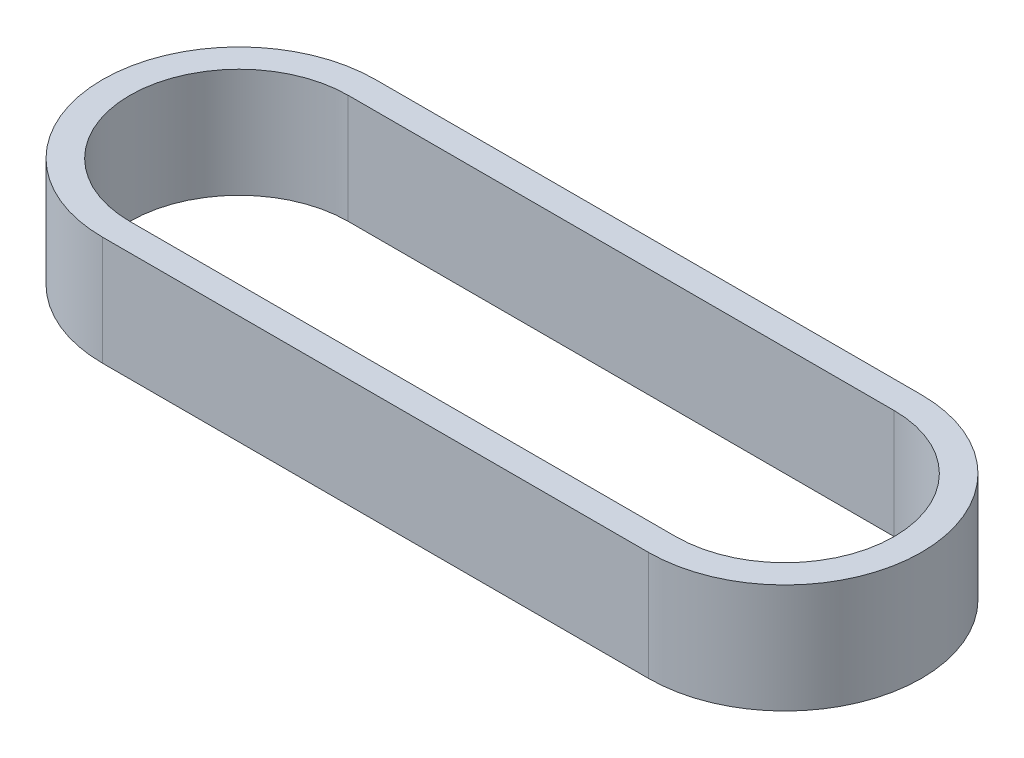
ISO-10303-21;
HEADER;
FILE_DESCRIPTION(('STEP AP214'),'2;1');
FILE_NAME('part.step','',(''),(''),'','','');
FILE_SCHEMA(('AUTOMOTIVE_DESIGN { 1 0 10303 214 1 1 1 1 }'));
ENDSEC;
DATA;
#1=APPLICATION_CONTEXT('core data for automotive mechanical design processes');
#2=APPLICATION_PROTOCOL_DEFINITION('international standard','automotive_design',2000,#1);
#3=PRODUCT_CONTEXT('',#1,'mechanical');
#4=PRODUCT('Part','Part','',(#3));
#5=PRODUCT_RELATED_PRODUCT_CATEGORY('part','',(#4));
#6=PRODUCT_DEFINITION_FORMATION('','',#4);
#7=PRODUCT_DEFINITION_CONTEXT('part definition',#1,'design');
#8=PRODUCT_DEFINITION('design','',#6,#7);
#9=PRODUCT_DEFINITION_SHAPE('','',#8);
#10=(LENGTH_UNIT() NAMED_UNIT(*) SI_UNIT(.MILLI.,.METRE.));
#11=(NAMED_UNIT(*) PLANE_ANGLE_UNIT() SI_UNIT($,.RADIAN.));
#12=(NAMED_UNIT(*) SI_UNIT($,.STERADIAN.) SOLID_ANGLE_UNIT());
#13=UNCERTAINTY_MEASURE_WITH_UNIT(LENGTH_MEASURE(1.E-05),#10,'distance_accuracy_value','');
#14=(GEOMETRIC_REPRESENTATION_CONTEXT(3) GLOBAL_UNCERTAINTY_ASSIGNED_CONTEXT((#13)) GLOBAL_UNIT_ASSIGNED_CONTEXT((#10,
#11,#12)) REPRESENTATION_CONTEXT('',''));
#15=CARTESIAN_POINT('',(0.,0.,0.));
#16=DIRECTION('',(0.,0.,1.));
#17=DIRECTION('',(1.,0.,0.));
#18=AXIS2_PLACEMENT_3D('',#15,#16,#17);
#19=CARTESIAN_POINT('',(-50.,20.,0.));
#20=DIRECTION('',(0.,-1.,0.));
#21=DIRECTION('',(0.,0.,-1.));
#22=AXIS2_PLACEMENT_3D('',#19,#20,#21);
#23=CYLINDRICAL_SURFACE('',#22,20.0000000000017);
#24=CARTESIAN_POINT('',(-50.,0.,0.));
#25=DIRECTION('',(0.,1.,0.));
#26=DIRECTION('',(0.,0.,1.));
#27=AXIS2_PLACEMENT_3D('',#24,#25,#26);
#28=CIRCLE('',#27,20.0000000000017);
#29=CARTESIAN_POINT('',(-50.,0.,-20.));
#30=VERTEX_POINT('',#29);
#31=CARTESIAN_POINT('',(-50.,0.,20.));
#32=VERTEX_POINT('',#31);
#33=EDGE_CURVE('E161',#30,#32,#28,.T.);
#34=ORIENTED_EDGE('',*,*,#33,.F.);
#35=DIRECTION('',(0.,-1.,0.));
#36=VECTOR('',#35,1.);
#37=CARTESIAN_POINT('',(-50.,20.,-20.));
#38=LINE('',#37,#36);
#39=CARTESIAN_POINT('',(-50.,20.,-20.));
#40=VERTEX_POINT('',#39);
#41=EDGE_CURVE('E11',#40,#30,#38,.T.);
#42=ORIENTED_EDGE('',*,*,#41,.F.);
#43=CARTESIAN_POINT('',(-50.,20.,0.));
#44=DIRECTION('',(0.,1.,0.));
#45=DIRECTION('',(0.,0.,1.));
#46=AXIS2_PLACEMENT_3D('',#43,#44,#45);
#47=CIRCLE('',#46,20.0000000000017);
#48=CARTESIAN_POINT('',(-50.,20.,20.));
#49=VERTEX_POINT('',#48);
#50=EDGE_CURVE('E126',#40,#49,#47,.T.);
#51=ORIENTED_EDGE('',*,*,#50,.T.);
#52=DIRECTION('',(0.,-1.,0.));
#53=VECTOR('',#52,1.);
#54=CARTESIAN_POINT('',(-50.,20.,20.));
#55=LINE('',#54,#53);
#56=EDGE_CURVE('E65',#49,#32,#55,.T.);
#57=ORIENTED_EDGE('',*,*,#56,.T.);
#58=EDGE_LOOP('',(#34,#42,#51,#57));
#59=FACE_BOUND('',#58,.T.);
#60=ADVANCED_FACE('F45',(#59),#23,.F.);
#61=CARTESIAN_POINT('',(0.,20.,-20.));
#62=DIRECTION('',(0.,0.,-1.));
#63=DIRECTION('',(-1.,0.,0.));
#64=AXIS2_PLACEMENT_3D('',#61,#62,#63);
#65=PLANE('',#64);
#66=DIRECTION('',(1.,0.,0.));
#67=VECTOR('',#66,1.);
#68=CARTESIAN_POINT('',(0.,0.,-20.));
#69=LINE('',#68,#67);
#70=CARTESIAN_POINT('',(50.,0.,-20.));
#71=VERTEX_POINT('',#70);
#72=EDGE_CURVE('E133',#30,#71,#69,.T.);
#73=ORIENTED_EDGE('',*,*,#72,.T.);
#74=DIRECTION('',(0.,-1.,0.));
#75=VECTOR('',#74,1.);
#76=CARTESIAN_POINT('',(50.,20.,-20.));
#77=LINE('',#76,#75);
#78=CARTESIAN_POINT('',(50.,20.,-20.));
#79=VERTEX_POINT('',#78);
#80=EDGE_CURVE('E56',#79,#71,#77,.T.);
#81=ORIENTED_EDGE('',*,*,#80,.F.);
#82=DIRECTION('',(1.,0.,0.));
#83=VECTOR('',#82,1.);
#84=CARTESIAN_POINT('',(0.,20.,-20.));
#85=LINE('',#84,#83);
#86=EDGE_CURVE('E120',#40,#79,#85,.T.);
#87=ORIENTED_EDGE('',*,*,#86,.F.);
#88=ORIENTED_EDGE('',*,*,#41,.T.);
#89=EDGE_LOOP('',(#73,#81,#87,#88));
#90=FACE_BOUND('',#89,.T.);
#91=ADVANCED_FACE('F131',(#90),#65,.F.);
#92=CARTESIAN_POINT('',(50.,20.,0.));
#93=DIRECTION('',(0.,-1.,0.));
#94=DIRECTION('',(0.,0.,-1.));
#95=AXIS2_PLACEMENT_3D('',#92,#93,#94);
#96=CYLINDRICAL_SURFACE('',#95,19.9999999999996);
#97=CARTESIAN_POINT('',(50.,0.,0.));
#98=DIRECTION('',(0.,1.,0.));
#99=DIRECTION('',(0.,0.,1.));
#100=AXIS2_PLACEMENT_3D('',#97,#98,#99);
#101=CIRCLE('',#100,19.9999999999996);
#102=CARTESIAN_POINT('',(50.,0.,20.));
#103=VERTEX_POINT('',#102);
#104=EDGE_CURVE('E166',#103,#71,#101,.T.);
#105=ORIENTED_EDGE('',*,*,#104,.F.);
#106=DIRECTION('',(0.,-1.,0.));
#107=VECTOR('',#106,1.);
#108=CARTESIAN_POINT('',(50.,20.,20.));
#109=LINE('',#108,#107);
#110=CARTESIAN_POINT('',(50.,20.,20.));
#111=VERTEX_POINT('',#110);
#112=EDGE_CURVE('E90',#111,#103,#109,.T.);
#113=ORIENTED_EDGE('',*,*,#112,.F.);
#114=CARTESIAN_POINT('',(50.,20.,0.));
#115=DIRECTION('',(0.,1.,0.));
#116=DIRECTION('',(0.,0.,1.));
#117=AXIS2_PLACEMENT_3D('',#114,#115,#116);
#118=CIRCLE('',#117,19.9999999999996);
#119=EDGE_CURVE('E125',#111,#79,#118,.T.);
#120=ORIENTED_EDGE('',*,*,#119,.T.);
#121=ORIENTED_EDGE('',*,*,#80,.T.);
#122=EDGE_LOOP('',(#105,#113,#120,#121));
#123=FACE_BOUND('',#122,.T.);
#124=ADVANCED_FACE('F138',(#123),#96,.F.);
#125=CARTESIAN_POINT('',(50.,20.,0.));
#126=DIRECTION('',(0.,-1.,0.));
#127=DIRECTION('',(0.,0.,-1.));
#128=AXIS2_PLACEMENT_3D('',#125,#126,#127);
#129=CYLINDRICAL_SURFACE('',#128,25.);
#130=CARTESIAN_POINT('',(50.,0.,0.));
#131=DIRECTION('',(0.,1.,0.));
#132=DIRECTION('',(0.,0.,1.));
#133=AXIS2_PLACEMENT_3D('',#130,#131,#132);
#134=CIRCLE('',#133,25.);
#135=CARTESIAN_POINT('',(50.,0.,25.));
#136=VERTEX_POINT('',#135);
#137=CARTESIAN_POINT('',(50.,0.,-25.));
#138=VERTEX_POINT('',#137);
#139=EDGE_CURVE('E147',#136,#138,#134,.T.);
#140=ORIENTED_EDGE('',*,*,#139,.T.);
#141=DIRECTION('',(0.,-1.,0.));
#142=VECTOR('',#141,1.);
#143=CARTESIAN_POINT('',(50.,20.,-25.));
#144=LINE('',#143,#142);
#145=CARTESIAN_POINT('',(50.,20.,-25.));
#146=VERTEX_POINT('',#145);
#147=EDGE_CURVE('E49',#146,#138,#144,.T.);
#148=ORIENTED_EDGE('',*,*,#147,.F.);
#149=CARTESIAN_POINT('',(50.,20.,0.));
#150=DIRECTION('',(0.,1.,0.));
#151=DIRECTION('',(0.,0.,1.));
#152=AXIS2_PLACEMENT_3D('',#149,#150,#151);
#153=CIRCLE('',#152,25.);
#154=CARTESIAN_POINT('',(50.,20.,25.));
#155=VERTEX_POINT('',#154);
#156=EDGE_CURVE('E103',#155,#146,#153,.T.);
#157=ORIENTED_EDGE('',*,*,#156,.F.);
#158=DIRECTION('',(0.,-1.,0.));
#159=VECTOR('',#158,1.);
#160=CARTESIAN_POINT('',(50.,20.,25.));
#161=LINE('',#160,#159);
#162=EDGE_CURVE('E143',#155,#136,#161,.T.);
#163=ORIENTED_EDGE('',*,*,#162,.T.);
#164=EDGE_LOOP('',(#140,#148,#157,#163));
#165=FACE_BOUND('',#164,.T.);
#166=ADVANCED_FACE('F47',(#165),#129,.T.);
#167=CARTESIAN_POINT('',(0.,20.,-25.));
#168=DIRECTION('',(0.,0.,-1.));
#169=DIRECTION('',(-1.,0.,0.));
#170=AXIS2_PLACEMENT_3D('',#167,#168,#169);
#171=PLANE('',#170);
#172=DIRECTION('',(1.,0.,0.));
#173=VECTOR('',#172,1.);
#174=CARTESIAN_POINT('',(0.,0.,-25.));
#175=LINE('',#174,#173);
#176=CARTESIAN_POINT('',(-50.,0.,-25.));
#177=VERTEX_POINT('',#176);
#178=EDGE_CURVE('E151',#177,#138,#175,.T.);
#179=ORIENTED_EDGE('',*,*,#178,.F.);
#180=DIRECTION('',(0.,-1.,0.));
#181=VECTOR('',#180,1.);
#182=CARTESIAN_POINT('',(-50.,20.,-25.));
#183=LINE('',#182,#181);
#184=CARTESIAN_POINT('',(-50.,20.,-25.));
#185=VERTEX_POINT('',#184);
#186=EDGE_CURVE('E183',#185,#177,#183,.T.);
#187=ORIENTED_EDGE('',*,*,#186,.F.);
#188=DIRECTION('',(1.,0.,0.));
#189=VECTOR('',#188,1.);
#190=CARTESIAN_POINT('',(0.,20.,-25.));
#191=LINE('',#190,#189);
#192=EDGE_CURVE('E193',#185,#146,#191,.T.);
#193=ORIENTED_EDGE('',*,*,#192,.T.);
#194=ORIENTED_EDGE('',*,*,#147,.T.);
#195=EDGE_LOOP('',(#179,#187,#193,#194));
#196=FACE_BOUND('',#195,.T.);
#197=ADVANCED_FACE('F192',(#196),#171,.T.);
#198=CARTESIAN_POINT('',(-50.,20.,0.));
#199=DIRECTION('',(0.,-1.,0.));
#200=DIRECTION('',(0.,0.,-1.));
#201=AXIS2_PLACEMENT_3D('',#198,#199,#200);
#202=CYLINDRICAL_SURFACE('',#201,25.);
#203=CARTESIAN_POINT('',(-50.,0.,0.));
#204=DIRECTION('',(0.,1.,0.));
#205=DIRECTION('',(0.,0.,1.));
#206=AXIS2_PLACEMENT_3D('',#203,#204,#205);
#207=CIRCLE('',#206,25.);
#208=CARTESIAN_POINT('',(-50.,0.,25.));
#209=VERTEX_POINT('',#208);
#210=EDGE_CURVE('E155',#177,#209,#207,.T.);
#211=ORIENTED_EDGE('',*,*,#210,.T.);
#212=DIRECTION('',(0.,-1.,0.));
#213=VECTOR('',#212,1.);
#214=CARTESIAN_POINT('',(-50.,20.,25.));
#215=LINE('',#214,#213);
#216=CARTESIAN_POINT('',(-50.,20.,25.));
#217=VERTEX_POINT('',#216);
#218=EDGE_CURVE('E180',#217,#209,#215,.T.);
#219=ORIENTED_EDGE('',*,*,#218,.F.);
#220=CARTESIAN_POINT('',(-50.,20.,0.));
#221=DIRECTION('',(0.,1.,0.));
#222=DIRECTION('',(0.,0.,1.));
#223=AXIS2_PLACEMENT_3D('',#220,#221,#222);
#224=CIRCLE('',#223,25.);
#225=EDGE_CURVE('E208',#185,#217,#224,.T.);
#226=ORIENTED_EDGE('',*,*,#225,.F.);
#227=ORIENTED_EDGE('',*,*,#186,.T.);
#228=EDGE_LOOP('',(#211,#219,#226,#227));
#229=FACE_BOUND('',#228,.T.);
#230=ADVANCED_FACE('F202',(#229),#202,.T.);
#231=CARTESIAN_POINT('',(0.,20.,25.));
#232=DIRECTION('',(0.,0.,-1.));
#233=DIRECTION('',(-1.,0.,0.));
#234=AXIS2_PLACEMENT_3D('',#231,#232,#233);
#235=PLANE('',#234);
#236=DIRECTION('',(1.,0.,0.));
#237=VECTOR('',#236,1.);
#238=CARTESIAN_POINT('',(0.,0.,25.));
#239=LINE('',#238,#237);
#240=EDGE_CURVE('E158',#209,#136,#239,.T.);
#241=ORIENTED_EDGE('',*,*,#240,.T.);
#242=ORIENTED_EDGE('',*,*,#162,.F.);
#243=DIRECTION('',(1.,0.,0.));
#244=VECTOR('',#243,1.);
#245=CARTESIAN_POINT('',(0.,20.,25.));
#246=LINE('',#245,#244);
#247=EDGE_CURVE('E206',#217,#155,#246,.T.);
#248=ORIENTED_EDGE('',*,*,#247,.F.);
#249=ORIENTED_EDGE('',*,*,#218,.T.);
#250=EDGE_LOOP('',(#241,#242,#248,#249));
#251=FACE_BOUND('',#250,.T.);
#252=ADVANCED_FACE('F205',(#251),#235,.F.);
#253=CARTESIAN_POINT('',(0.,20.,20.));
#254=DIRECTION('',(0.,0.,-1.));
#255=DIRECTION('',(-1.,0.,0.));
#256=AXIS2_PLACEMENT_3D('',#253,#254,#255);
#257=PLANE('',#256);
#258=DIRECTION('',(1.,0.,0.));
#259=VECTOR('',#258,1.);
#260=CARTESIAN_POINT('',(0.,0.,20.));
#261=LINE('',#260,#259);
#262=EDGE_CURVE('E169',#32,#103,#261,.T.);
#263=ORIENTED_EDGE('',*,*,#262,.F.);
#264=ORIENTED_EDGE('',*,*,#56,.F.);
#265=DIRECTION('',(1.,0.,0.));
#266=VECTOR('',#265,1.);
#267=CARTESIAN_POINT('',(0.,20.,20.));
#268=LINE('',#267,#266);
#269=EDGE_CURVE('E140',#49,#111,#268,.T.);
#270=ORIENTED_EDGE('',*,*,#269,.T.);
#271=ORIENTED_EDGE('',*,*,#112,.T.);
#272=EDGE_LOOP('',(#263,#264,#270,#271));
#273=FACE_BOUND('',#272,.T.);
#274=ADVANCED_FACE('F218',(#273),#257,.T.);
#275=CARTESIAN_POINT('',(0.,20.,0.));
#276=DIRECTION('',(0.,1.,0.));
#277=DIRECTION('',(0.,0.,1.));
#278=AXIS2_PLACEMENT_3D('',#275,#276,#277);
#279=PLANE('',#278);
#280=ORIENTED_EDGE('',*,*,#156,.T.);
#281=ORIENTED_EDGE('',*,*,#192,.F.);
#282=ORIENTED_EDGE('',*,*,#225,.T.);
#283=ORIENTED_EDGE('',*,*,#247,.T.);
#284=EDGE_LOOP('',(#280,#281,#282,#283));
#285=FACE_BOUND('',#284,.T.);
#286=ORIENTED_EDGE('',*,*,#50,.F.);
#287=ORIENTED_EDGE('',*,*,#86,.T.);
#288=ORIENTED_EDGE('',*,*,#119,.F.);
#289=ORIENTED_EDGE('',*,*,#269,.F.);
#290=EDGE_LOOP('',(#286,#287,#288,#289));
#291=FACE_BOUND('',#290,.T.);
#292=ADVANCED_FACE('F122',(#285,#291),#279,.T.);
#293=CARTESIAN_POINT('',(0.,0.,0.));
#294=DIRECTION('',(0.,1.,0.));
#295=DIRECTION('',(0.,0.,1.));
#296=AXIS2_PLACEMENT_3D('',#293,#294,#295);
#297=PLANE('',#296);
#298=ORIENTED_EDGE('',*,*,#139,.F.);
#299=ORIENTED_EDGE('',*,*,#240,.F.);
#300=ORIENTED_EDGE('',*,*,#210,.F.);
#301=ORIENTED_EDGE('',*,*,#178,.T.);
#302=EDGE_LOOP('',(#298,#299,#300,#301));
#303=FACE_BOUND('',#302,.T.);
#304=ORIENTED_EDGE('',*,*,#33,.T.);
#305=ORIENTED_EDGE('',*,*,#262,.T.);
#306=ORIENTED_EDGE('',*,*,#104,.T.);
#307=ORIENTED_EDGE('',*,*,#72,.F.);
#308=EDGE_LOOP('',(#304,#305,#306,#307));
#309=FACE_BOUND('',#308,.T.);
#310=ADVANCED_FACE('F199',(#303,#309),#297,.F.);
#311=CLOSED_SHELL('',(#60,#91,#124,#166,#197,#230,#252,#274,#292,#310));
#312=MANIFOLD_SOLID_BREP('B2',#311);
#313=ADVANCED_BREP_SHAPE_REPRESENTATION('',(#18,#312),#14);
#314=SHAPE_DEFINITION_REPRESENTATION(#9,#313);
ENDSEC;
END-ISO-10303-21;
